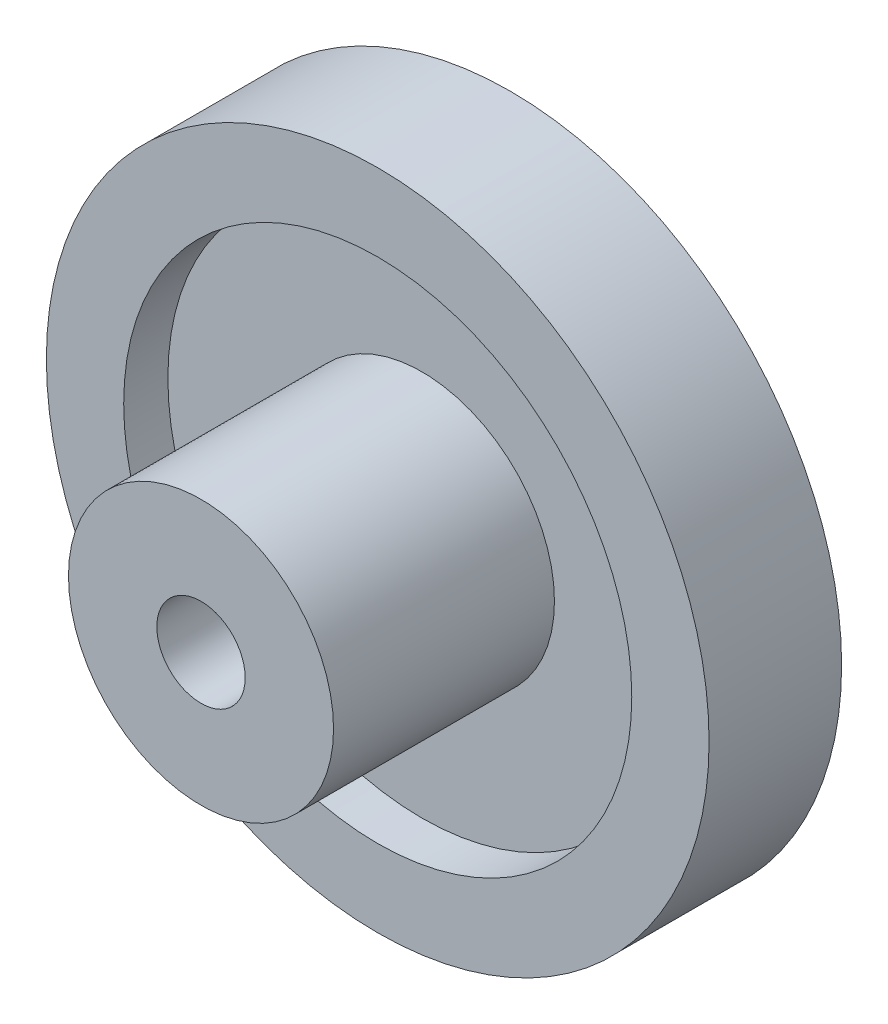
ISO-10303-21;
HEADER;
FILE_DESCRIPTION(('STEP AP214'),'2;1');
FILE_NAME('part.step','',(''),(''),'','','');
FILE_SCHEMA(('AUTOMOTIVE_DESIGN { 1 0 10303 214 1 1 1 1 }'));
ENDSEC;
DATA;
#1=APPLICATION_CONTEXT('core data for automotive mechanical design processes');
#2=APPLICATION_PROTOCOL_DEFINITION('international standard','automotive_design',2000,#1);
#3=PRODUCT_CONTEXT('',#1,'mechanical');
#4=PRODUCT('Part','Part','',(#3));
#5=PRODUCT_RELATED_PRODUCT_CATEGORY('part','',(#4));
#6=PRODUCT_DEFINITION_FORMATION('','',#4);
#7=PRODUCT_DEFINITION_CONTEXT('part definition',#1,'design');
#8=PRODUCT_DEFINITION('design','',#6,#7);
#9=PRODUCT_DEFINITION_SHAPE('','',#8);
#10=(LENGTH_UNIT() NAMED_UNIT(*) SI_UNIT(.MILLI.,.METRE.));
#11=(NAMED_UNIT(*) PLANE_ANGLE_UNIT() SI_UNIT($,.RADIAN.));
#12=(NAMED_UNIT(*) SI_UNIT($,.STERADIAN.) SOLID_ANGLE_UNIT());
#13=UNCERTAINTY_MEASURE_WITH_UNIT(LENGTH_MEASURE(1.E-05),#10,'distance_accuracy_value','');
#14=(GEOMETRIC_REPRESENTATION_CONTEXT(3) GLOBAL_UNCERTAINTY_ASSIGNED_CONTEXT((#13)) GLOBAL_UNIT_ASSIGNED_CONTEXT((#10,
#11,#12)) REPRESENTATION_CONTEXT('',''));
#15=CARTESIAN_POINT('',(0.,0.,0.));
#16=DIRECTION('',(0.,0.,1.));
#17=DIRECTION('',(1.,0.,0.));
#18=AXIS2_PLACEMENT_3D('',#15,#16,#17);
#19=CARTESIAN_POINT('',(0.,0.,2.));
#20=DIRECTION('',(0.,0.,1.));
#21=DIRECTION('',(1.00000000000001,0.,0.));
#22=AXIS2_PLACEMENT_3D('',#19,#20,#21);
#23=PLANE('',#22);
#24=CARTESIAN_POINT('',(0.,0.,2.));
#25=DIRECTION('',(0.,0.,1.));
#26=DIRECTION('',(1.00000000000001,0.,0.));
#27=AXIS2_PLACEMENT_3D('',#24,#25,#26);
#28=CIRCLE('',#27,2.99999999999882);
#29=CARTESIAN_POINT('',(2.99999999999885,0.,2.));
#30=VERTEX_POINT('',#29);
#31=EDGE_CURVE('E61',#30,#30,#28,.T.);
#32=ORIENTED_EDGE('',*,*,#31,.F.);
#33=EDGE_LOOP('',(#32));
#34=FACE_BOUND('',#33,.T.);
#35=CARTESIAN_POINT('',(0.,0.,2.));
#36=DIRECTION('',(0.,0.,1.));
#37=DIRECTION('',(1.00000000000001,0.,0.));
#38=AXIS2_PLACEMENT_3D('',#35,#36,#37);
#39=CIRCLE('',#38,5.75);
#40=CARTESIAN_POINT('',(5.75000000000006,0.,2.));
#41=VERTEX_POINT('',#40);
#42=EDGE_CURVE('E54',#41,#41,#39,.T.);
#43=ORIENTED_EDGE('',*,*,#42,.T.);
#44=EDGE_LOOP('',(#43));
#45=FACE_BOUND('',#44,.T.);
#46=ADVANCED_FACE('F39',(#34,#45),#23,.T.);
#47=CARTESIAN_POINT('',(0.,0.,3.));
#48=DIRECTION('',(0.,0.,-1.));
#49=DIRECTION('',(-1.00000000000001,0.,0.));
#50=AXIS2_PLACEMENT_3D('',#47,#48,#49);
#51=CYLINDRICAL_SURFACE('',#50,1.);
#52=CARTESIAN_POINT('',(0.,0.,7.));
#53=DIRECTION('',(0.,0.,1.));
#54=DIRECTION('',(1.00000000000001,0.,0.));
#55=AXIS2_PLACEMENT_3D('',#52,#53,#54);
#56=CIRCLE('',#55,1.);
#57=CARTESIAN_POINT('',(0.999999999999993,0.,7.));
#58=VERTEX_POINT('',#57);
#59=EDGE_CURVE('E64',#58,#58,#56,.T.);
#60=ORIENTED_EDGE('',*,*,#59,.T.);
#61=EDGE_LOOP('',(#60));
#62=FACE_BOUND('',#61,.T.);
#63=CARTESIAN_POINT('',(0.,0.,0.));
#64=DIRECTION('',(0.,0.,1.));
#65=DIRECTION('',(1.00000000000001,0.,0.));
#66=AXIS2_PLACEMENT_3D('',#63,#64,#65);
#67=CIRCLE('',#66,1.);
#68=CARTESIAN_POINT('',(0.999999999999993,0.,0.));
#69=VERTEX_POINT('',#68);
#70=EDGE_CURVE('E50',#69,#69,#67,.T.);
#71=ORIENTED_EDGE('',*,*,#70,.F.);
#72=EDGE_LOOP('',(#71));
#73=FACE_BOUND('',#72,.T.);
#74=ADVANCED_FACE('F70',(#62,#73),#51,.F.);
#75=CARTESIAN_POINT('',(7.05270605516369,0.125316979418713,3.));
#76=DIRECTION('',(0.,0.,-1.));
#77=DIRECTION('',(-1.00000000000001,0.,0.));
#78=AXIS2_PLACEMENT_3D('',#75,#76,#77);
#79=PLANE('',#78);
#80=CARTESIAN_POINT('',(0.,0.,3.));
#81=DIRECTION('',(0.,0.,1.));
#82=DIRECTION('',(1.00000000000001,0.,0.));
#83=AXIS2_PLACEMENT_3D('',#80,#81,#82);
#84=CIRCLE('',#83,7.5);
#85=CARTESIAN_POINT('',(7.50000000000006,0.,3.));
#86=VERTEX_POINT('',#85);
#87=EDGE_CURVE('E10',#86,#86,#84,.T.);
#88=ORIENTED_EDGE('',*,*,#87,.T.);
#89=EDGE_LOOP('',(#88));
#90=FACE_BOUND('',#89,.T.);
#91=CARTESIAN_POINT('',(0.,0.,3.));
#92=DIRECTION('',(0.,0.,1.));
#93=DIRECTION('',(1.00000000000001,0.,0.));
#94=AXIS2_PLACEMENT_3D('',#91,#92,#93);
#95=CIRCLE('',#94,5.75);
#96=CARTESIAN_POINT('',(5.75000000000004,0.,3.));
#97=VERTEX_POINT('',#96);
#98=EDGE_CURVE('E55',#97,#97,#95,.T.);
#99=ORIENTED_EDGE('',*,*,#98,.F.);
#100=EDGE_LOOP('',(#99));
#101=FACE_BOUND('',#100,.T.);
#102=ADVANCED_FACE('F93',(#90,#101),#79,.F.);
#103=CARTESIAN_POINT('',(7.0527060551637,0.125316979418714,0.));
#104=DIRECTION('',(0.,0.,-1.));
#105=DIRECTION('',(-1.00000000000001,0.,0.));
#106=AXIS2_PLACEMENT_3D('',#103,#104,#105);
#107=PLANE('',#106);
#108=CARTESIAN_POINT('',(0.,0.,0.));
#109=DIRECTION('',(0.,0.,1.));
#110=DIRECTION('',(1.00000000000001,0.,0.));
#111=AXIS2_PLACEMENT_3D('',#108,#109,#110);
#112=CIRCLE('',#111,7.49999999999998);
#113=CARTESIAN_POINT('',(7.50000000000004,0.,0.));
#114=VERTEX_POINT('',#113);
#115=EDGE_CURVE('E43',#114,#114,#112,.T.);
#116=ORIENTED_EDGE('',*,*,#115,.F.);
#117=EDGE_LOOP('',(#116));
#118=FACE_BOUND('',#117,.T.);
#119=ORIENTED_EDGE('',*,*,#70,.T.);
#120=EDGE_LOOP('',(#119));
#121=FACE_BOUND('',#120,.T.);
#122=ADVANCED_FACE('F99',(#118,#121),#107,.T.);
#123=CARTESIAN_POINT('',(0.,0.,3.));
#124=DIRECTION('',(0.,0.,-1.));
#125=DIRECTION('',(-1.00000000000001,0.,0.));
#126=AXIS2_PLACEMENT_3D('',#123,#124,#125);
#127=CYLINDRICAL_SURFACE('',#126,7.49999999999998);
#128=ORIENTED_EDGE('',*,*,#115,.T.);
#129=EDGE_LOOP('',(#128));
#130=FACE_BOUND('',#129,.T.);
#131=ORIENTED_EDGE('',*,*,#87,.F.);
#132=EDGE_LOOP('',(#131));
#133=FACE_BOUND('',#132,.T.);
#134=ADVANCED_FACE('F41',(#130,#133),#127,.T.);
#135=CARTESIAN_POINT('',(0.,0.,2.));
#136=DIRECTION('',(0.,0.,1.));
#137=DIRECTION('',(1.00000000000001,0.,0.));
#138=AXIS2_PLACEMENT_3D('',#135,#136,#137);
#139=CYLINDRICAL_SURFACE('',#138,5.75);
#140=ORIENTED_EDGE('',*,*,#42,.F.);
#141=EDGE_LOOP('',(#140));
#142=FACE_BOUND('',#141,.T.);
#143=ORIENTED_EDGE('',*,*,#98,.T.);
#144=EDGE_LOOP('',(#143));
#145=FACE_BOUND('',#144,.T.);
#146=ADVANCED_FACE('F76',(#142,#145),#139,.F.);
#147=CARTESIAN_POINT('',(2.08425656763282,-0.00200455213732534,7.));
#148=DIRECTION('',(0.,0.,1.));
#149=DIRECTION('',(1.00000000000001,0.,0.));
#150=AXIS2_PLACEMENT_3D('',#147,#148,#149);
#151=PLANE('',#150);
#152=CARTESIAN_POINT('',(0.,0.,7.));
#153=DIRECTION('',(0.,0.,1.));
#154=DIRECTION('',(1.00000000000001,0.,0.));
#155=AXIS2_PLACEMENT_3D('',#152,#153,#154);
#156=CIRCLE('',#155,2.99999999999882);
#157=CARTESIAN_POINT('',(2.99999999999883,0.,7.));
#158=VERTEX_POINT('',#157);
#159=EDGE_CURVE('E58',#158,#158,#156,.T.);
#160=ORIENTED_EDGE('',*,*,#159,.T.);
#161=EDGE_LOOP('',(#160));
#162=FACE_BOUND('',#161,.T.);
#163=ORIENTED_EDGE('',*,*,#59,.F.);
#164=EDGE_LOOP('',(#163));
#165=FACE_BOUND('',#164,.T.);
#166=ADVANCED_FACE('F73',(#162,#165),#151,.T.);
#167=CARTESIAN_POINT('',(0.,0.,7.));
#168=DIRECTION('',(0.,0.,-1.));
#169=DIRECTION('',(-1.00000000000001,0.,0.));
#170=AXIS2_PLACEMENT_3D('',#167,#168,#169);
#171=CYLINDRICAL_SURFACE('',#170,2.99999999999882);
#172=ORIENTED_EDGE('',*,*,#31,.T.);
#173=EDGE_LOOP('',(#172));
#174=FACE_BOUND('',#173,.T.);
#175=ORIENTED_EDGE('',*,*,#159,.F.);
#176=EDGE_LOOP('',(#175));
#177=FACE_BOUND('',#176,.T.);
#178=ADVANCED_FACE('F75',(#174,#177),#171,.T.);
#179=CLOSED_SHELL('',(#46,#74,#102,#122,#134,#146,#166,#178));
#180=MANIFOLD_SOLID_BREP('B2',#179);
#181=ADVANCED_BREP_SHAPE_REPRESENTATION('',(#18,#180),#14);
#182=SHAPE_DEFINITION_REPRESENTATION(#9,#181);
ENDSEC;
END-ISO-10303-21;
